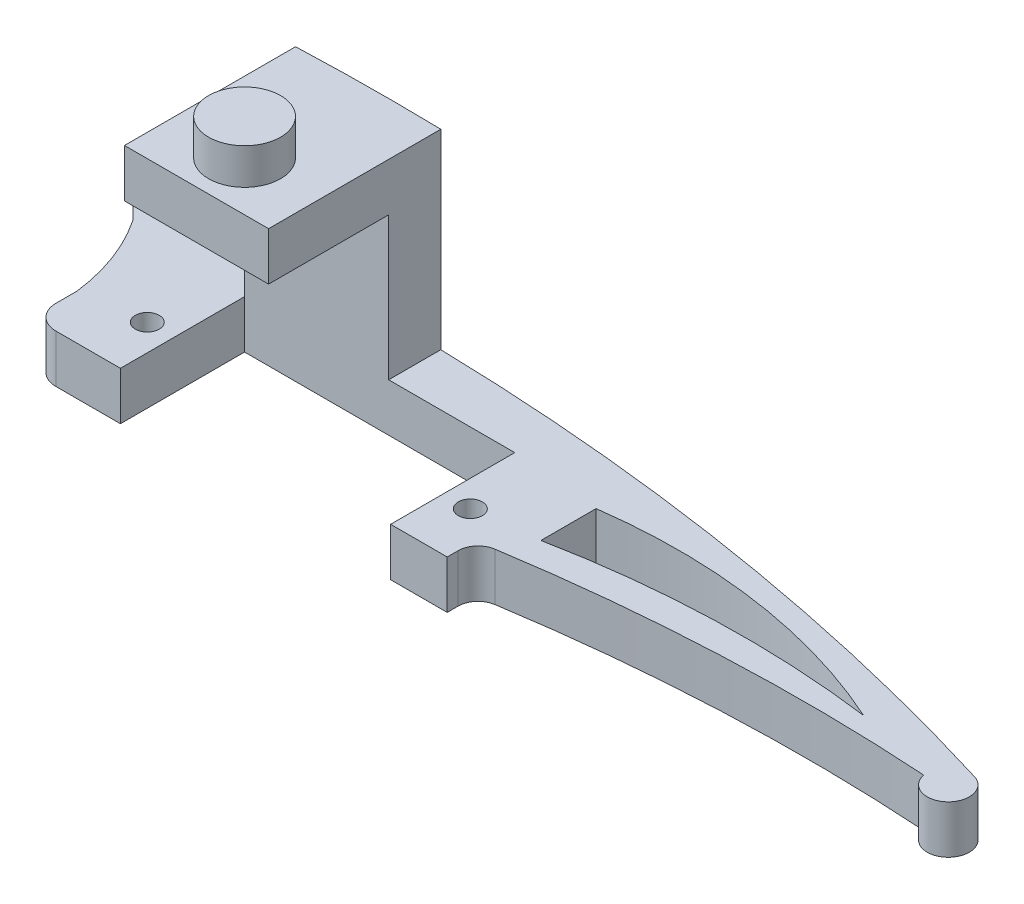
ISO-10303-21;
HEADER;
FILE_DESCRIPTION(('STEP AP214'),'2;1');
FILE_NAME('part.step','',(''),(''),'','','');
FILE_SCHEMA(('AUTOMOTIVE_DESIGN { 1 0 10303 214 1 1 1 1 }'));
ENDSEC;
DATA;
#1=APPLICATION_CONTEXT('core data for automotive mechanical design processes');
#2=APPLICATION_PROTOCOL_DEFINITION('international standard','automotive_design',2000,#1);
#3=PRODUCT_CONTEXT('',#1,'mechanical');
#4=PRODUCT('Part','Part','',(#3));
#5=PRODUCT_RELATED_PRODUCT_CATEGORY('part','',(#4));
#6=PRODUCT_DEFINITION_FORMATION('','',#4);
#7=PRODUCT_DEFINITION_CONTEXT('part definition',#1,'design');
#8=PRODUCT_DEFINITION('design','',#6,#7);
#9=PRODUCT_DEFINITION_SHAPE('','',#8);
#10=(LENGTH_UNIT() NAMED_UNIT(*) SI_UNIT(.MILLI.,.METRE.));
#11=(NAMED_UNIT(*) PLANE_ANGLE_UNIT() SI_UNIT($,.RADIAN.));
#12=(NAMED_UNIT(*) SI_UNIT($,.STERADIAN.) SOLID_ANGLE_UNIT());
#13=UNCERTAINTY_MEASURE_WITH_UNIT(LENGTH_MEASURE(1.E-05),#10,'distance_accuracy_value','');
#14=(GEOMETRIC_REPRESENTATION_CONTEXT(3) GLOBAL_UNCERTAINTY_ASSIGNED_CONTEXT((#13)) GLOBAL_UNIT_ASSIGNED_CONTEXT((#10,
#11,#12)) REPRESENTATION_CONTEXT('',''));
#15=CARTESIAN_POINT('',(0.,0.,0.));
#16=DIRECTION('',(0.,0.,1.));
#17=DIRECTION('',(1.,0.,0.));
#18=AXIS2_PLACEMENT_3D('',#15,#16,#17);
#19=CARTESIAN_POINT('',(14.,2.,-5.9));
#20=DIRECTION('',(0.,0.,-1.));
#21=DIRECTION('',(-1.,0.,0.));
#22=AXIS2_PLACEMENT_3D('',#19,#20,#21);
#23=PLANE('',#22);
#24=DIRECTION('',(1.,0.,0.));
#25=VECTOR('',#24,1.);
#26=CARTESIAN_POINT('',(14.,13.9,-5.9));
#27=LINE('',#26,#25);
#28=CARTESIAN_POINT('',(14.,13.9,-5.9));
#29=VERTEX_POINT('',#28);
#30=CARTESIAN_POINT('',(26.,13.9,-5.9));
#31=VERTEX_POINT('',#30);
#32=EDGE_CURVE('E221',#29,#31,#27,.T.);
#33=ORIENTED_EDGE('',*,*,#32,.F.);
#34=DIRECTION('',(0.,-1.,0.));
#35=VECTOR('',#34,1.);
#36=CARTESIAN_POINT('',(14.,17.9,-5.9));
#37=LINE('',#36,#35);
#38=CARTESIAN_POINT('',(14.,2.,-5.9));
#39=VERTEX_POINT('',#38);
#40=EDGE_CURVE('E225',#29,#39,#37,.T.);
#41=ORIENTED_EDGE('',*,*,#40,.T.);
#42=DIRECTION('',(0.,-1.,0.));
#43=VECTOR('',#42,1.);
#44=CARTESIAN_POINT('',(14.,2.,-5.9));
#45=LINE('',#44,#43);
#46=CARTESIAN_POINT('',(14.,-2.,-5.9));
#47=VERTEX_POINT('',#46);
#48=EDGE_CURVE('E38',#39,#47,#45,.T.);
#49=ORIENTED_EDGE('',*,*,#48,.T.);
#50=DIRECTION('',(1.,0.,0.));
#51=VECTOR('',#50,1.);
#52=CARTESIAN_POINT('',(14.,-2.,-5.9));
#53=LINE('',#52,#51);
#54=CARTESIAN_POINT('',(36.5,-2.,-5.9));
#55=VERTEX_POINT('',#54);
#56=EDGE_CURVE('E320',#47,#55,#53,.T.);
#57=ORIENTED_EDGE('',*,*,#56,.T.);
#58=DIRECTION('',(0.,-1.,0.));
#59=VECTOR('',#58,1.);
#60=CARTESIAN_POINT('',(36.5,2.,-5.9));
#61=LINE('',#60,#59);
#62=CARTESIAN_POINT('',(36.5,2.,-5.9));
#63=VERTEX_POINT('',#62);
#64=EDGE_CURVE('E391',#63,#55,#61,.T.);
#65=ORIENTED_EDGE('',*,*,#64,.F.);
#66=DIRECTION('',(1.,0.,0.));
#67=VECTOR('',#66,1.);
#68=CARTESIAN_POINT('',(14.,2.,-5.9));
#69=LINE('',#68,#67);
#70=CARTESIAN_POINT('',(26.,2.,-5.9));
#71=VERTEX_POINT('',#70);
#72=EDGE_CURVE('E286',#71,#63,#69,.T.);
#73=ORIENTED_EDGE('',*,*,#72,.F.);
#74=DIRECTION('',(0.,-1.,0.));
#75=VECTOR('',#74,1.);
#76=CARTESIAN_POINT('',(26.,17.9,-5.9));
#77=LINE('',#76,#75);
#78=EDGE_CURVE('E58',#31,#71,#77,.T.);
#79=ORIENTED_EDGE('',*,*,#78,.F.);
#80=EDGE_LOOP('',(#33,#41,#49,#57,#65,#73,#79));
#81=FACE_BOUND('',#80,.T.);
#82=ADVANCED_FACE('F34',(#81),#23,.F.);
#83=CARTESIAN_POINT('',(8.62634024035574,2.,2.4385181586324));
#84=DIRECTION('',(0.,-1.,0.));
#85=DIRECTION('',(0.,0.,-1.));
#86=AXIS2_PLACEMENT_3D('',#83,#84,#85);
#87=PLANE('',#86);
#88=CARTESIAN_POINT('',(11.8,2.,0.));
#89=DIRECTION('',(0.,1.,0.));
#90=DIRECTION('',(0.,0.,1.));
#91=AXIS2_PLACEMENT_3D('',#88,#89,#90);
#92=CIRCLE('',#91,1.);
#93=CARTESIAN_POINT('',(11.8,2.,1.));
#94=VERTEX_POINT('',#93);
#95=EDGE_CURVE('E278',#94,#94,#92,.T.);
#96=ORIENTED_EDGE('',*,*,#95,.F.);
#97=EDGE_LOOP('',(#96));
#98=FACE_BOUND('',#97,.T.);
#99=DIRECTION('',(0.,0.,1.));
#100=VECTOR('',#99,1.);
#101=CARTESIAN_POINT('',(14.,2.,-5.9));
#102=LINE('',#101,#100);
#103=CARTESIAN_POINT('',(14.,2.,-10.1461044190017));
#104=VERTEX_POINT('',#103);
#105=EDGE_CURVE('E50',#104,#39,#102,.T.);
#106=ORIENTED_EDGE('',*,*,#105,.F.);
#107=CARTESIAN_POINT('',(21.5542197661014,2.,185.548621723486));
#108=DIRECTION('',(0.,1.,0.));
#109=DIRECTION('',(0.,0.,1.));
#110=AXIS2_PLACEMENT_3D('',#107,#108,#109);
#111=CIRCLE('',#110,195.840476092808);
#112=CARTESIAN_POINT('',(10.0716883526537,2.,-9.95494230693514));
#113=VERTEX_POINT('',#112);
#114=EDGE_CURVE('E301',#104,#113,#111,.T.);
#115=ORIENTED_EDGE('',*,*,#114,.T.);
#116=CARTESIAN_POINT('',(-6.28370304347102,2.,28.8142367742464));
#117=DIRECTION('',(0.,1.,0.));
#118=DIRECTION('',(0.,0.,1.));
#119=AXIS2_PLACEMENT_3D('',#116,#117,#118);
#120=CIRCLE('',#119,42.0778810582132);
#121=CARTESIAN_POINT('',(1.62029316355011,2.,-12.5146262431236));
#122=VERTEX_POINT('',#121);
#123=EDGE_CURVE('E304',#113,#122,#120,.T.);
#124=ORIENTED_EDGE('',*,*,#123,.T.);
#125=CARTESIAN_POINT('',(1.36406447187878,2.,-11.1748431483622));
#126=DIRECTION('',(0.,1.,0.));
#127=DIRECTION('',(0.,0.,1.));
#128=AXIS2_PLACEMENT_3D('',#125,#126,#127);
#129=CIRCLE('',#128,1.36406447187879);
#130=CARTESIAN_POINT('',(0.399525233837648,2.,-10.2103039103211));
#131=VERTEX_POINT('',#130);
#132=EDGE_CURVE('E306',#122,#131,#129,.T.);
#133=ORIENTED_EDGE('',*,*,#132,.T.);
#134=DIRECTION('',(0.707106781186548,0.,0.707106781186547));
#135=VECTOR('',#134,1.);
#136=CARTESIAN_POINT('',(0.399525233837649,2.,-10.2103039103211));
#137=LINE('',#136,#135);
#138=CARTESIAN_POINT('',(3.82191689743255,2.,-6.78791224672617));
#139=VERTEX_POINT('',#138);
#140=EDGE_CURVE('E308',#131,#139,#137,.T.);
#141=ORIENTED_EDGE('',*,*,#140,.T.);
#142=CARTESIAN_POINT('',(-10.1704841528173,2.,2.72257085172816));
#143=DIRECTION('',(0.,-1.,0.));
#144=DIRECTION('',(0.,0.,-1.));
#145=AXIS2_PLACEMENT_3D('',#142,#143,#144);
#146=CIRCLE('',#145,16.9185275930566);
#147=CARTESIAN_POINT('',(6.62634024035574,2.,0.696918803145781));
#148=VERTEX_POINT('',#147);
#149=EDGE_CURVE('E310',#139,#148,#146,.T.);
#150=ORIENTED_EDGE('',*,*,#149,.T.);
#151=DIRECTION('',(0.,0.,1.));
#152=VECTOR('',#151,1.);
#153=CARTESIAN_POINT('',(6.62634024035574,2.,2.43851815863239));
#154=LINE('',#153,#152);
#155=CARTESIAN_POINT('',(6.62634024035574,2.,2.43851815863239));
#156=VERTEX_POINT('',#155);
#157=EDGE_CURVE('E312',#148,#156,#154,.T.);
#158=ORIENTED_EDGE('',*,*,#157,.T.);
#159=CARTESIAN_POINT('',(8.62634024035574,2.,2.4385181586324));
#160=DIRECTION('',(0.,1.,0.));
#161=DIRECTION('',(0.,0.,-1.));
#162=AXIS2_PLACEMENT_3D('',#159,#160,#161);
#163=CIRCLE('',#162,2.);
#164=CARTESIAN_POINT('',(8.62634024035575,2.,4.4385181586324));
#165=VERTEX_POINT('',#164);
#166=EDGE_CURVE('E314',#156,#165,#163,.T.);
#167=ORIENTED_EDGE('',*,*,#166,.T.);
#168=DIRECTION('',(1.,0.,0.));
#169=VECTOR('',#168,1.);
#170=CARTESIAN_POINT('',(14.,2.,4.4385181586324));
#171=LINE('',#170,#169);
#172=CARTESIAN_POINT('',(14.,2.,4.4385181586324));
#173=VERTEX_POINT('',#172);
#174=EDGE_CURVE('E316',#165,#173,#171,.T.);
#175=ORIENTED_EDGE('',*,*,#174,.T.);
#176=DIRECTION('',(0.,0.,-1.));
#177=VECTOR('',#176,1.);
#178=CARTESIAN_POINT('',(14.,2.,0.));
#179=LINE('',#178,#177);
#180=EDGE_CURVE('E284',#173,#39,#179,.T.);
#181=ORIENTED_EDGE('',*,*,#180,.T.);
#182=EDGE_LOOP('',(#106,#115,#124,#133,#141,#150,#158,#167,#175,#181));
#183=FACE_BOUND('',#182,.T.);
#184=ADVANCED_FACE('F433',(#98,#183),#87,.F.);
#185=CARTESIAN_POINT('',(50.3927536626238,2.,41.8430559351532));
#186=DIRECTION('',(0.,1.,0.));
#187=DIRECTION('',(0.,0.,1.));
#188=AXIS2_PLACEMENT_3D('',#185,#186,#187);
#189=CIRCLE('',#188,47.53522273895);
#190=CARTESIAN_POINT('',(69.981420933368,2.,-1.46839192101599));
#191=VERTEX_POINT('',#190);
#192=CARTESIAN_POINT('',(43.9242543366505,2.,-5.25));
#193=VERTEX_POINT('',#192);
#194=EDGE_CURVE('E248',#191,#193,#189,.T.);
#195=ORIENTED_EDGE('',*,*,#194,.F.);
#196=CARTESIAN_POINT('',(59.4329039404455,2.,77.9048055553327));
#197=DIRECTION('',(0.,-1.,0.));
#198=DIRECTION('',(0.,0.,-1.));
#199=AXIS2_PLACEMENT_3D('',#196,#197,#198);
#200=CIRCLE('',#199,80.071066487024);
#201=CARTESIAN_POINT('',(43.9242543366505,2.,-0.649999999999998));
#202=VERTEX_POINT('',#201);
#203=EDGE_CURVE('E254',#202,#191,#200,.T.);
#204=ORIENTED_EDGE('',*,*,#203,.F.);
#205=DIRECTION('',(0.,0.,1.));
#206=VECTOR('',#205,1.);
#207=CARTESIAN_POINT('',(43.9242543366505,2.,-5.25));
#208=LINE('',#207,#206);
#209=EDGE_CURVE('E250',#193,#202,#208,.T.);
#210=ORIENTED_EDGE('',*,*,#209,.F.);
#211=EDGE_LOOP('',(#195,#204,#210));
#212=FACE_BOUND('',#211,.T.);
#213=CARTESIAN_POINT('',(38.7,2.,0.));
#214=DIRECTION('',(0.,1.,0.));
#215=DIRECTION('',(0.,0.,1.));
#216=AXIS2_PLACEMENT_3D('',#213,#214,#215);
#217=CIRCLE('',#216,0.999999999999998);
#218=CARTESIAN_POINT('',(38.7,2.,0.999999999999998));
#219=VERTEX_POINT('',#218);
#220=EDGE_CURVE('E272',#219,#219,#217,.T.);
#221=ORIENTED_EDGE('',*,*,#220,.F.);
#222=EDGE_LOOP('',(#221));
#223=FACE_BOUND('',#222,.T.);
#224=DIRECTION('',(0.,0.,-1.));
#225=VECTOR('',#224,1.);
#226=CARTESIAN_POINT('',(26.,2.,-5.9));
#227=LINE('',#226,#225);
#228=CARTESIAN_POINT('',(26.,2.,-10.2413859744797));
#229=VERTEX_POINT('',#228);
#230=EDGE_CURVE('E226',#71,#229,#227,.T.);
#231=ORIENTED_EDGE('',*,*,#230,.F.);
#232=ORIENTED_EDGE('',*,*,#72,.T.);
#233=DIRECTION('',(0.,0.,1.));
#234=VECTOR('',#233,1.);
#235=CARTESIAN_POINT('',(36.5,2.,-5.9));
#236=LINE('',#235,#234);
#237=CARTESIAN_POINT('',(36.5,2.,4.4385181586324));
#238=VERTEX_POINT('',#237);
#239=EDGE_CURVE('E289',#63,#238,#236,.T.);
#240=ORIENTED_EDGE('',*,*,#239,.T.);
#241=DIRECTION('',(1.,0.,0.));
#242=VECTOR('',#241,1.);
#243=CARTESIAN_POINT('',(36.5,2.,4.4385181586324));
#244=LINE('',#243,#242);
#245=CARTESIAN_POINT('',(41.2135196632889,2.,4.4385181586324));
#246=VERTEX_POINT('',#245);
#247=EDGE_CURVE('E291',#238,#246,#244,.T.);
#248=ORIENTED_EDGE('',*,*,#247,.T.);
#249=DIRECTION('',(0.,0.,-1.));
#250=VECTOR('',#249,1.);
#251=CARTESIAN_POINT('',(41.2135196632889,2.,4.4385181586324));
#252=LINE('',#251,#250);
#253=CARTESIAN_POINT('',(41.2135196632889,2.,3.53621429674051));
#254=VERTEX_POINT('',#253);
#255=EDGE_CURVE('E293',#246,#254,#252,.T.);
#256=ORIENTED_EDGE('',*,*,#255,.T.);
#257=CARTESIAN_POINT('',(42.8824091488573,2.,3.53621429674051));
#258=DIRECTION('',(0.,-1.,0.));
#259=DIRECTION('',(0.,0.,-1.));
#260=AXIS2_PLACEMENT_3D('',#257,#258,#259);
#261=CIRCLE('',#260,1.66888948556837);
#262=CARTESIAN_POINT('',(42.621822840626,2.,1.88779478369079));
#263=VERTEX_POINT('',#262);
#264=EDGE_CURVE('E295',#254,#263,#261,.T.);
#265=ORIENTED_EDGE('',*,*,#264,.T.);
#266=CARTESIAN_POINT('',(66.6949978674598,2.,154.170129663986));
#267=DIRECTION('',(0.,-1.,0.));
#268=DIRECTION('',(0.,0.,-1.));
#269=AXIS2_PLACEMENT_3D('',#266,#267,#268);
#270=CIRCLE('',#269,154.173367584895);
#271=CARTESIAN_POINT('',(76.7808257933976,2.,0.32701689154066));
#272=VERTEX_POINT('',#271);
#273=EDGE_CURVE('E297',#263,#272,#270,.T.);
#274=ORIENTED_EDGE('',*,*,#273,.T.);
#275=CARTESIAN_POINT('',(78.5,2.,0.));
#276=DIRECTION('',(0.,1.,0.));
#277=DIRECTION('',(0.,0.,1.));
#278=AXIS2_PLACEMENT_3D('',#275,#276,#277);
#279=CIRCLE('',#278,1.75);
#280=CARTESIAN_POINT('',(79.0134467049361,2.,-1.67298310845934));
#281=VERTEX_POINT('',#280);
#282=EDGE_CURVE('E299',#272,#281,#279,.T.);
#283=ORIENTED_EDGE('',*,*,#282,.T.);
#284=EDGE_CURVE('E302',#281,#229,#111,.T.);
#285=ORIENTED_EDGE('',*,*,#284,.T.);
#286=EDGE_LOOP('',(#231,#232,#240,#248,#256,#265,#274,#283,#285));
#287=FACE_BOUND('',#286,.T.);
#288=ADVANCED_FACE('F416',(#212,#223,#287),#87,.F.);
#289=CARTESIAN_POINT('',(8.62634024035574,-2.,2.4385181586324));
#290=DIRECTION('',(0.,-1.,0.));
#291=DIRECTION('',(0.,0.,-1.));
#292=AXIS2_PLACEMENT_3D('',#289,#290,#291);
#293=PLANE('',#292);
#294=CARTESIAN_POINT('',(11.8,-2.,0.));
#295=DIRECTION('',(0.,1.,0.));
#296=DIRECTION('',(0.,0.,1.));
#297=AXIS2_PLACEMENT_3D('',#294,#295,#296);
#298=CIRCLE('',#297,1.);
#299=CARTESIAN_POINT('',(11.8,-2.,1.));
#300=VERTEX_POINT('',#299);
#301=EDGE_CURVE('E275',#300,#300,#298,.T.);
#302=ORIENTED_EDGE('',*,*,#301,.T.);
#303=EDGE_LOOP('',(#302));
#304=FACE_BOUND('',#303,.T.);
#305=DIRECTION('',(0.,0.,-1.));
#306=VECTOR('',#305,1.);
#307=CARTESIAN_POINT('',(14.,-2.,0.));
#308=LINE('',#307,#306);
#309=CARTESIAN_POINT('',(14.,-2.,4.4385181586324));
#310=VERTEX_POINT('',#309);
#311=EDGE_CURVE('E281',#310,#47,#308,.T.);
#312=ORIENTED_EDGE('',*,*,#311,.F.);
#313=DIRECTION('',(1.,0.,0.));
#314=VECTOR('',#313,1.);
#315=CARTESIAN_POINT('',(14.,-2.,4.4385181586324));
#316=LINE('',#315,#314);
#317=CARTESIAN_POINT('',(8.62634024035575,-2.,4.4385181586324));
#318=VERTEX_POINT('',#317);
#319=EDGE_CURVE('E287',#318,#310,#316,.T.);
#320=ORIENTED_EDGE('',*,*,#319,.F.);
#321=CARTESIAN_POINT('',(8.62634024035574,-2.,2.4385181586324));
#322=DIRECTION('',(0.,1.,0.));
#323=DIRECTION('',(0.,0.,-1.));
#324=AXIS2_PLACEMENT_3D('',#321,#322,#323);
#325=CIRCLE('',#324,2.);
#326=CARTESIAN_POINT('',(6.62634024035574,-2.,2.43851815863239));
#327=VERTEX_POINT('',#326);
#328=EDGE_CURVE('E347',#327,#318,#325,.T.);
#329=ORIENTED_EDGE('',*,*,#328,.F.);
#330=DIRECTION('',(0.,0.,1.));
#331=VECTOR('',#330,1.);
#332=CARTESIAN_POINT('',(6.62634024035574,-2.,2.43851815863239));
#333=LINE('',#332,#331);
#334=CARTESIAN_POINT('',(6.62634024035574,-2.,0.696918803145781));
#335=VERTEX_POINT('',#334);
#336=EDGE_CURVE('E345',#335,#327,#333,.T.);
#337=ORIENTED_EDGE('',*,*,#336,.F.);
#338=CARTESIAN_POINT('',(-10.1704841528173,-2.,2.72257085172816));
#339=DIRECTION('',(0.,-1.,0.));
#340=DIRECTION('',(0.,0.,-1.));
#341=AXIS2_PLACEMENT_3D('',#338,#339,#340);
#342=CIRCLE('',#341,16.9185275930566);
#343=CARTESIAN_POINT('',(3.82191689743255,-2.,-6.78791224672617));
#344=VERTEX_POINT('',#343);
#345=EDGE_CURVE('E343',#344,#335,#342,.T.);
#346=ORIENTED_EDGE('',*,*,#345,.F.);
#347=DIRECTION('',(0.707106781186548,0.,0.707106781186547));
#348=VECTOR('',#347,1.);
#349=CARTESIAN_POINT('',(0.399525233837649,-2.,-10.2103039103211));
#350=LINE('',#349,#348);
#351=CARTESIAN_POINT('',(0.399525233837648,-2.,-10.2103039103211));
#352=VERTEX_POINT('',#351);
#353=EDGE_CURVE('E341',#352,#344,#350,.T.);
#354=ORIENTED_EDGE('',*,*,#353,.F.);
#355=CARTESIAN_POINT('',(1.36406447187878,-2.,-11.1748431483622));
#356=DIRECTION('',(0.,1.,0.));
#357=DIRECTION('',(0.,0.,1.));
#358=AXIS2_PLACEMENT_3D('',#355,#356,#357);
#359=CIRCLE('',#358,1.36406447187879);
#360=CARTESIAN_POINT('',(1.62029316355011,-2.,-12.5146262431236));
#361=VERTEX_POINT('',#360);
#362=EDGE_CURVE('E339',#361,#352,#359,.T.);
#363=ORIENTED_EDGE('',*,*,#362,.F.);
#364=CARTESIAN_POINT('',(-6.28370304347102,-2.,28.8142367742464));
#365=DIRECTION('',(0.,1.,0.));
#366=DIRECTION('',(0.,0.,1.));
#367=AXIS2_PLACEMENT_3D('',#364,#365,#366);
#368=CIRCLE('',#367,42.0778810582132);
#369=CARTESIAN_POINT('',(10.0716883526537,-2.,-9.95494230693514));
#370=VERTEX_POINT('',#369);
#371=EDGE_CURVE('E337',#370,#361,#368,.T.);
#372=ORIENTED_EDGE('',*,*,#371,.F.);
#373=CARTESIAN_POINT('',(21.5542197661014,-2.,185.548621723486));
#374=DIRECTION('',(0.,1.,0.));
#375=DIRECTION('',(0.,0.,1.));
#376=AXIS2_PLACEMENT_3D('',#373,#374,#375);
#377=CIRCLE('',#376,195.840476092808);
#378=CARTESIAN_POINT('',(79.0134467049361,-2.,-1.67298310845934));
#379=VERTEX_POINT('',#378);
#380=EDGE_CURVE('E335',#379,#370,#377,.T.);
#381=ORIENTED_EDGE('',*,*,#380,.F.);
#382=CARTESIAN_POINT('',(78.5,-2.,0.));
#383=DIRECTION('',(0.,1.,0.));
#384=DIRECTION('',(0.,0.,1.));
#385=AXIS2_PLACEMENT_3D('',#382,#383,#384);
#386=CIRCLE('',#385,1.75);
#387=CARTESIAN_POINT('',(76.7808257933976,-2.,0.32701689154066));
#388=VERTEX_POINT('',#387);
#389=EDGE_CURVE('E333',#388,#379,#386,.T.);
#390=ORIENTED_EDGE('',*,*,#389,.F.);
#391=CARTESIAN_POINT('',(66.6949978674598,-2.,154.170129663986));
#392=DIRECTION('',(0.,-1.,0.));
#393=DIRECTION('',(0.,0.,-1.));
#394=AXIS2_PLACEMENT_3D('',#391,#392,#393);
#395=CIRCLE('',#394,154.173367584895);
#396=CARTESIAN_POINT('',(42.621822840626,-2.,1.88779478369079));
#397=VERTEX_POINT('',#396);
#398=EDGE_CURVE('E331',#397,#388,#395,.T.);
#399=ORIENTED_EDGE('',*,*,#398,.F.);
#400=CARTESIAN_POINT('',(42.8824091488573,-2.,3.53621429674051));
#401=DIRECTION('',(0.,-1.,0.));
#402=DIRECTION('',(0.,0.,-1.));
#403=AXIS2_PLACEMENT_3D('',#400,#401,#402);
#404=CIRCLE('',#403,1.66888948556837);
#405=CARTESIAN_POINT('',(41.2135196632889,-2.,3.53621429674051));
#406=VERTEX_POINT('',#405);
#407=EDGE_CURVE('E329',#406,#397,#404,.T.);
#408=ORIENTED_EDGE('',*,*,#407,.F.);
#409=DIRECTION('',(0.,0.,-1.));
#410=VECTOR('',#409,1.);
#411=CARTESIAN_POINT('',(41.2135196632889,-2.,4.4385181586324));
#412=LINE('',#411,#410);
#413=CARTESIAN_POINT('',(41.2135196632889,-2.,4.4385181586324));
#414=VERTEX_POINT('',#413);
#415=EDGE_CURVE('E327',#414,#406,#412,.T.);
#416=ORIENTED_EDGE('',*,*,#415,.F.);
#417=DIRECTION('',(1.,0.,0.));
#418=VECTOR('',#417,1.);
#419=CARTESIAN_POINT('',(36.5,-2.,4.4385181586324));
#420=LINE('',#419,#418);
#421=CARTESIAN_POINT('',(36.5,-2.,4.4385181586324));
#422=VERTEX_POINT('',#421);
#423=EDGE_CURVE('E325',#422,#414,#420,.T.);
#424=ORIENTED_EDGE('',*,*,#423,.F.);
#425=DIRECTION('',(0.,0.,1.));
#426=VECTOR('',#425,1.);
#427=CARTESIAN_POINT('',(36.5,-2.,0.));
#428=LINE('',#427,#426);
#429=EDGE_CURVE('E323',#55,#422,#428,.T.);
#430=ORIENTED_EDGE('',*,*,#429,.F.);
#431=ORIENTED_EDGE('',*,*,#56,.F.);
#432=EDGE_LOOP('',(#312,#320,#329,#337,#346,#354,#363,#372,#381,#390,#399,#408,#416,#424,#430,#431));
#433=FACE_BOUND('',#432,.T.);
#434=CARTESIAN_POINT('',(38.7,-2.,0.));
#435=DIRECTION('',(0.,1.,0.));
#436=DIRECTION('',(0.,0.,1.));
#437=AXIS2_PLACEMENT_3D('',#434,#435,#436);
#438=CIRCLE('',#437,0.999999999999998);
#439=CARTESIAN_POINT('',(38.7,-2.,0.999999999999998));
#440=VERTEX_POINT('',#439);
#441=EDGE_CURVE('E271',#440,#440,#438,.T.);
#442=ORIENTED_EDGE('',*,*,#441,.T.);
#443=EDGE_LOOP('',(#442));
#444=FACE_BOUND('',#443,.T.);
#445=CARTESIAN_POINT('',(59.4329039404455,-2.,77.9048055553327));
#446=DIRECTION('',(0.,-1.,0.));
#447=DIRECTION('',(0.,0.,-1.));
#448=AXIS2_PLACEMENT_3D('',#445,#446,#447);
#449=CIRCLE('',#448,80.071066487024);
#450=CARTESIAN_POINT('',(43.9242543366505,-2.,-0.65));
#451=VERTEX_POINT('',#450);
#452=CARTESIAN_POINT('',(69.981420933368,-2.,-1.46839192101599));
#453=VERTEX_POINT('',#452);
#454=EDGE_CURVE('E251',#451,#453,#449,.T.);
#455=ORIENTED_EDGE('',*,*,#454,.T.);
#456=CARTESIAN_POINT('',(50.3927536626238,-2.,41.8430559351532));
#457=DIRECTION('',(0.,1.,0.));
#458=DIRECTION('',(0.,0.,1.));
#459=AXIS2_PLACEMENT_3D('',#456,#457,#458);
#460=CIRCLE('',#459,47.53522273895);
#461=CARTESIAN_POINT('',(43.9242543366505,-2.,-5.25));
#462=VERTEX_POINT('',#461);
#463=EDGE_CURVE('E247',#453,#462,#460,.T.);
#464=ORIENTED_EDGE('',*,*,#463,.T.);
#465=DIRECTION('',(0.,0.,1.));
#466=VECTOR('',#465,1.);
#467=CARTESIAN_POINT('',(43.9242543366505,-2.,-5.25));
#468=LINE('',#467,#466);
#469=EDGE_CURVE('E259',#462,#451,#468,.T.);
#470=ORIENTED_EDGE('',*,*,#469,.T.);
#471=EDGE_LOOP('',(#455,#464,#470));
#472=FACE_BOUND('',#471,.T.);
#473=ADVANCED_FACE('F403',(#304,#433,#444,#472),#293,.T.);
#474=CARTESIAN_POINT('',(14.,2.,0.));
#475=DIRECTION('',(-1.,0.,0.));
#476=DIRECTION('',(0.,0.,1.));
#477=AXIS2_PLACEMENT_3D('',#474,#475,#476);
#478=PLANE('',#477);
#479=ORIENTED_EDGE('',*,*,#311,.T.);
#480=ORIENTED_EDGE('',*,*,#48,.F.);
#481=ORIENTED_EDGE('',*,*,#180,.F.);
#482=DIRECTION('',(0.,-1.,0.));
#483=VECTOR('',#482,1.);
#484=CARTESIAN_POINT('',(14.,2.,4.4385181586324));
#485=LINE('',#484,#483);
#486=EDGE_CURVE('E318',#173,#310,#485,.T.);
#487=ORIENTED_EDGE('',*,*,#486,.T.);
#488=EDGE_LOOP('',(#479,#480,#481,#487));
#489=FACE_BOUND('',#488,.T.);
#490=ADVANCED_FACE('F36',(#489),#478,.F.);
#491=CARTESIAN_POINT('',(36.5,2.,0.));
#492=DIRECTION('',(1.,0.,0.));
#493=DIRECTION('',(0.,0.,-1.));
#494=AXIS2_PLACEMENT_3D('',#491,#492,#493);
#495=PLANE('',#494);
#496=ORIENTED_EDGE('',*,*,#429,.T.);
#497=DIRECTION('',(0.,-1.,0.));
#498=VECTOR('',#497,1.);
#499=CARTESIAN_POINT('',(36.5,2.,4.4385181586324));
#500=LINE('',#499,#498);
#501=EDGE_CURVE('E389',#238,#422,#500,.T.);
#502=ORIENTED_EDGE('',*,*,#501,.F.);
#503=ORIENTED_EDGE('',*,*,#239,.F.);
#504=ORIENTED_EDGE('',*,*,#64,.T.);
#505=EDGE_LOOP('',(#496,#502,#503,#504));
#506=FACE_BOUND('',#505,.T.);
#507=ADVANCED_FACE('F409',(#506),#495,.F.);
#508=CARTESIAN_POINT('',(36.5,2.,4.4385181586324));
#509=DIRECTION('',(0.,0.,-1.));
#510=DIRECTION('',(-1.,0.,0.));
#511=AXIS2_PLACEMENT_3D('',#508,#509,#510);
#512=PLANE('',#511);
#513=ORIENTED_EDGE('',*,*,#423,.T.);
#514=DIRECTION('',(0.,-1.,0.));
#515=VECTOR('',#514,1.);
#516=CARTESIAN_POINT('',(41.2135196632889,2.,4.4385181586324));
#517=LINE('',#516,#515);
#518=EDGE_CURVE('E386',#246,#414,#517,.T.);
#519=ORIENTED_EDGE('',*,*,#518,.F.);
#520=ORIENTED_EDGE('',*,*,#247,.F.);
#521=ORIENTED_EDGE('',*,*,#501,.T.);
#522=EDGE_LOOP('',(#513,#519,#520,#521));
#523=FACE_BOUND('',#522,.T.);
#524=ADVANCED_FACE('F412',(#523),#512,.F.);
#525=CARTESIAN_POINT('',(41.2135196632889,2.,4.4385181586324));
#526=DIRECTION('',(-1.,0.,0.));
#527=DIRECTION('',(0.,0.,1.));
#528=AXIS2_PLACEMENT_3D('',#525,#526,#527);
#529=PLANE('',#528);
#530=ORIENTED_EDGE('',*,*,#415,.T.);
#531=DIRECTION('',(0.,-1.,0.));
#532=VECTOR('',#531,1.);
#533=CARTESIAN_POINT('',(41.2135196632889,2.,3.53621429674051));
#534=LINE('',#533,#532);
#535=EDGE_CURVE('E383',#254,#406,#534,.T.);
#536=ORIENTED_EDGE('',*,*,#535,.F.);
#537=ORIENTED_EDGE('',*,*,#255,.F.);
#538=ORIENTED_EDGE('',*,*,#518,.T.);
#539=EDGE_LOOP('',(#530,#536,#537,#538));
#540=FACE_BOUND('',#539,.T.);
#541=ADVANCED_FACE('F484',(#540),#529,.F.);
#542=CARTESIAN_POINT('',(42.8824091488573,2.,3.53621429674051));
#543=DIRECTION('',(0.,-1.,0.));
#544=DIRECTION('',(0.,0.,-1.));
#545=AXIS2_PLACEMENT_3D('',#542,#543,#544);
#546=CYLINDRICAL_SURFACE('',#545,1.66888948556837);
#547=ORIENTED_EDGE('',*,*,#407,.T.);
#548=DIRECTION('',(0.,-1.,0.));
#549=VECTOR('',#548,1.);
#550=CARTESIAN_POINT('',(42.621822840626,2.,1.88779478369079));
#551=LINE('',#550,#549);
#552=EDGE_CURVE('E380',#263,#397,#551,.T.);
#553=ORIENTED_EDGE('',*,*,#552,.F.);
#554=ORIENTED_EDGE('',*,*,#264,.F.);
#555=ORIENTED_EDGE('',*,*,#535,.T.);
#556=EDGE_LOOP('',(#547,#553,#554,#555));
#557=FACE_BOUND('',#556,.T.);
#558=ADVANCED_FACE('F487',(#557),#546,.F.);
#559=CARTESIAN_POINT('',(66.6949978674598,2.,154.170129663986));
#560=DIRECTION('',(0.,-1.,0.));
#561=DIRECTION('',(0.,0.,-1.));
#562=AXIS2_PLACEMENT_3D('',#559,#560,#561);
#563=CYLINDRICAL_SURFACE('',#562,154.173367584895);
#564=ORIENTED_EDGE('',*,*,#398,.T.);
#565=DIRECTION('',(0.,-1.,0.));
#566=VECTOR('',#565,1.);
#567=CARTESIAN_POINT('',(76.7808257933976,2.,0.32701689154066));
#568=LINE('',#567,#566);
#569=EDGE_CURVE('E377',#272,#388,#568,.T.);
#570=ORIENTED_EDGE('',*,*,#569,.F.);
#571=ORIENTED_EDGE('',*,*,#273,.F.);
#572=ORIENTED_EDGE('',*,*,#552,.T.);
#573=EDGE_LOOP('',(#564,#570,#571,#572));
#574=FACE_BOUND('',#573,.T.);
#575=ADVANCED_FACE('F491',(#574),#563,.F.);
#576=CARTESIAN_POINT('',(78.5,2.,0.));
#577=DIRECTION('',(0.,-1.,0.));
#578=DIRECTION('',(0.,0.,-1.));
#579=AXIS2_PLACEMENT_3D('',#576,#577,#578);
#580=CYLINDRICAL_SURFACE('',#579,1.75);
#581=ORIENTED_EDGE('',*,*,#389,.T.);
#582=DIRECTION('',(0.,-1.,0.));
#583=VECTOR('',#582,1.);
#584=CARTESIAN_POINT('',(79.0134467049361,2.,-1.67298310845934));
#585=LINE('',#584,#583);
#586=EDGE_CURVE('E374',#281,#379,#585,.T.);
#587=ORIENTED_EDGE('',*,*,#586,.F.);
#588=ORIENTED_EDGE('',*,*,#282,.F.);
#589=ORIENTED_EDGE('',*,*,#569,.T.);
#590=EDGE_LOOP('',(#581,#587,#588,#589));
#591=FACE_BOUND('',#590,.T.);
#592=ADVANCED_FACE('F495',(#591),#580,.T.);
#593=CARTESIAN_POINT('',(21.5542197661014,2.,185.548621723486));
#594=DIRECTION('',(0.,-1.,0.));
#595=DIRECTION('',(0.,0.,-1.));
#596=AXIS2_PLACEMENT_3D('',#593,#594,#595);
#597=CYLINDRICAL_SURFACE('',#596,195.840476092808);
#598=ORIENTED_EDGE('',*,*,#380,.T.);
#599=DIRECTION('',(0.,-1.,0.));
#600=VECTOR('',#599,1.);
#601=CARTESIAN_POINT('',(10.0716883526537,2.,-9.95494230693514));
#602=LINE('',#601,#600);
#603=EDGE_CURVE('E371',#113,#370,#602,.T.);
#604=ORIENTED_EDGE('',*,*,#603,.F.);
#605=ORIENTED_EDGE('',*,*,#114,.F.);
#606=DIRECTION('',(0.,-1.,0.));
#607=VECTOR('',#606,1.);
#608=CARTESIAN_POINT('',(14.,17.9,-10.1461044190011));
#609=LINE('',#608,#607);
#610=CARTESIAN_POINT('',(14.,17.9,-10.1461044190011));
#611=VERTEX_POINT('',#610);
#612=EDGE_CURVE('E240',#611,#104,#609,.T.);
#613=ORIENTED_EDGE('',*,*,#612,.F.);
#614=CARTESIAN_POINT('',(21.5542197661014,17.9,185.548621723486));
#615=DIRECTION('',(0.,1.,0.));
#616=DIRECTION('',(0.,0.,1.));
#617=AXIS2_PLACEMENT_3D('',#614,#615,#616);
#618=CIRCLE('',#617,195.840476092808);
#619=CARTESIAN_POINT('',(26.,17.9,-10.2413859744797));
#620=VERTEX_POINT('',#619);
#621=EDGE_CURVE('E234',#620,#611,#618,.T.);
#622=ORIENTED_EDGE('',*,*,#621,.F.);
#623=DIRECTION('',(0.,-1.,0.));
#624=VECTOR('',#623,1.);
#625=CARTESIAN_POINT('',(26.,17.9,-10.2413859744797));
#626=LINE('',#625,#624);
#627=EDGE_CURVE('E243',#620,#229,#626,.T.);
#628=ORIENTED_EDGE('',*,*,#627,.T.);
#629=ORIENTED_EDGE('',*,*,#284,.F.);
#630=ORIENTED_EDGE('',*,*,#586,.T.);
#631=EDGE_LOOP('',(#598,#604,#605,#613,#622,#628,#629,#630));
#632=FACE_BOUND('',#631,.T.);
#633=ADVANCED_FACE('F430',(#632),#597,.T.);
#634=CARTESIAN_POINT('',(-6.28370304347102,2.,28.8142367742464));
#635=DIRECTION('',(0.,-1.,0.));
#636=DIRECTION('',(0.,0.,-1.));
#637=AXIS2_PLACEMENT_3D('',#634,#635,#636);
#638=CYLINDRICAL_SURFACE('',#637,42.0778810582132);
#639=ORIENTED_EDGE('',*,*,#371,.T.);
#640=DIRECTION('',(0.,-1.,0.));
#641=VECTOR('',#640,1.);
#642=CARTESIAN_POINT('',(1.62029316355011,2.,-12.5146262431236));
#643=LINE('',#642,#641);
#644=EDGE_CURVE('E368',#122,#361,#643,.T.);
#645=ORIENTED_EDGE('',*,*,#644,.F.);
#646=ORIENTED_EDGE('',*,*,#123,.F.);
#647=ORIENTED_EDGE('',*,*,#603,.T.);
#648=EDGE_LOOP('',(#639,#645,#646,#647));
#649=FACE_BOUND('',#648,.T.);
#650=ADVANCED_FACE('F438',(#649),#638,.T.);
#651=CARTESIAN_POINT('',(1.36406447187878,2.,-11.1748431483622));
#652=DIRECTION('',(0.,-1.,0.));
#653=DIRECTION('',(0.,0.,-1.));
#654=AXIS2_PLACEMENT_3D('',#651,#652,#653);
#655=CYLINDRICAL_SURFACE('',#654,1.36406447187879);
#656=ORIENTED_EDGE('',*,*,#362,.T.);
#657=DIRECTION('',(0.,-1.,0.));
#658=VECTOR('',#657,1.);
#659=CARTESIAN_POINT('',(0.399525233837648,2.,-10.2103039103211));
#660=LINE('',#659,#658);
#661=EDGE_CURVE('E365',#131,#352,#660,.T.);
#662=ORIENTED_EDGE('',*,*,#661,.F.);
#663=ORIENTED_EDGE('',*,*,#132,.F.);
#664=ORIENTED_EDGE('',*,*,#644,.T.);
#665=EDGE_LOOP('',(#656,#662,#663,#664));
#666=FACE_BOUND('',#665,.T.);
#667=ADVANCED_FACE('F442',(#666),#655,.T.);
#668=CARTESIAN_POINT('',(0.399525233837649,2.,-10.2103039103211));
#669=DIRECTION('',(0.707106781186547,0.,-0.707106781186548));
#670=DIRECTION('',(-0.707106781186548,0.,-0.707106781186547));
#671=AXIS2_PLACEMENT_3D('',#668,#669,#670);
#672=PLANE('',#671);
#673=ORIENTED_EDGE('',*,*,#353,.T.);
#674=DIRECTION('',(0.,-1.,0.));
#675=VECTOR('',#674,1.);
#676=CARTESIAN_POINT('',(3.82191689743255,2.,-6.78791224672617));
#677=LINE('',#676,#675);
#678=EDGE_CURVE('E362',#139,#344,#677,.T.);
#679=ORIENTED_EDGE('',*,*,#678,.F.);
#680=ORIENTED_EDGE('',*,*,#140,.F.);
#681=ORIENTED_EDGE('',*,*,#661,.T.);
#682=EDGE_LOOP('',(#673,#679,#680,#681));
#683=FACE_BOUND('',#682,.T.);
#684=ADVANCED_FACE('F447',(#683),#672,.F.);
#685=CARTESIAN_POINT('',(-10.1704841528173,2.,2.72257085172816));
#686=DIRECTION('',(0.,-1.,0.));
#687=DIRECTION('',(0.,0.,-1.));
#688=AXIS2_PLACEMENT_3D('',#685,#686,#687);
#689=CYLINDRICAL_SURFACE('',#688,16.9185275930566);
#690=ORIENTED_EDGE('',*,*,#345,.T.);
#691=DIRECTION('',(0.,-1.,0.));
#692=VECTOR('',#691,1.);
#693=CARTESIAN_POINT('',(6.62634024035574,2.,0.696918803145781));
#694=LINE('',#693,#692);
#695=EDGE_CURVE('E359',#148,#335,#694,.T.);
#696=ORIENTED_EDGE('',*,*,#695,.F.);
#697=ORIENTED_EDGE('',*,*,#149,.F.);
#698=ORIENTED_EDGE('',*,*,#678,.T.);
#699=EDGE_LOOP('',(#690,#696,#697,#698));
#700=FACE_BOUND('',#699,.T.);
#701=ADVANCED_FACE('F453',(#700),#689,.F.);
#702=CARTESIAN_POINT('',(6.62634024035574,2.,2.43851815863239));
#703=DIRECTION('',(1.,0.,0.));
#704=DIRECTION('',(0.,0.,-1.));
#705=AXIS2_PLACEMENT_3D('',#702,#703,#704);
#706=PLANE('',#705);
#707=ORIENTED_EDGE('',*,*,#336,.T.);
#708=DIRECTION('',(0.,-1.,0.));
#709=VECTOR('',#708,1.);
#710=CARTESIAN_POINT('',(6.62634024035574,2.,2.43851815863239));
#711=LINE('',#710,#709);
#712=EDGE_CURVE('E356',#156,#327,#711,.T.);
#713=ORIENTED_EDGE('',*,*,#712,.F.);
#714=ORIENTED_EDGE('',*,*,#157,.F.);
#715=ORIENTED_EDGE('',*,*,#695,.T.);
#716=EDGE_LOOP('',(#707,#713,#714,#715));
#717=FACE_BOUND('',#716,.T.);
#718=ADVANCED_FACE('F457',(#717),#706,.F.);
#719=CARTESIAN_POINT('',(8.62634024035574,2.,2.4385181586324));
#720=DIRECTION('',(0.,-1.,0.));
#721=DIRECTION('',(0.,0.,-1.));
#722=AXIS2_PLACEMENT_3D('',#719,#720,#721);
#723=CYLINDRICAL_SURFACE('',#722,2.);
#724=ORIENTED_EDGE('',*,*,#328,.T.);
#725=DIRECTION('',(0.,-1.,0.));
#726=VECTOR('',#725,1.);
#727=CARTESIAN_POINT('',(8.62634024035575,2.,4.4385181586324));
#728=LINE('',#727,#726);
#729=EDGE_CURVE('E353',#165,#318,#728,.T.);
#730=ORIENTED_EDGE('',*,*,#729,.F.);
#731=ORIENTED_EDGE('',*,*,#166,.F.);
#732=ORIENTED_EDGE('',*,*,#712,.T.);
#733=EDGE_LOOP('',(#724,#730,#731,#732));
#734=FACE_BOUND('',#733,.T.);
#735=ADVANCED_FACE('F462',(#734),#723,.T.);
#736=CARTESIAN_POINT('',(14.,2.,4.4385181586324));
#737=DIRECTION('',(0.,0.,-1.));
#738=DIRECTION('',(-1.,0.,0.));
#739=AXIS2_PLACEMENT_3D('',#736,#737,#738);
#740=PLANE('',#739);
#741=ORIENTED_EDGE('',*,*,#319,.T.);
#742=ORIENTED_EDGE('',*,*,#486,.F.);
#743=ORIENTED_EDGE('',*,*,#174,.F.);
#744=ORIENTED_EDGE('',*,*,#729,.T.);
#745=EDGE_LOOP('',(#741,#742,#743,#744));
#746=FACE_BOUND('',#745,.T.);
#747=ADVANCED_FACE('F466',(#746),#740,.F.);
#748=CARTESIAN_POINT('',(11.8,2.,0.));
#749=DIRECTION('',(0.,-1.,0.));
#750=DIRECTION('',(0.,0.,-1.));
#751=AXIS2_PLACEMENT_3D('',#748,#749,#750);
#752=CYLINDRICAL_SURFACE('',#751,1.);
#753=ORIENTED_EDGE('',*,*,#95,.T.);
#754=EDGE_LOOP('',(#753));
#755=FACE_BOUND('',#754,.T.);
#756=ORIENTED_EDGE('',*,*,#301,.F.);
#757=EDGE_LOOP('',(#756));
#758=FACE_BOUND('',#757,.T.);
#759=ADVANCED_FACE('F515',(#755,#758),#752,.F.);
#760=CARTESIAN_POINT('',(38.7,2.,0.));
#761=DIRECTION('',(0.,-1.,0.));
#762=DIRECTION('',(0.,0.,-1.));
#763=AXIS2_PLACEMENT_3D('',#760,#761,#762);
#764=CYLINDRICAL_SURFACE('',#763,0.999999999999998);
#765=ORIENTED_EDGE('',*,*,#220,.T.);
#766=EDGE_LOOP('',(#765));
#767=FACE_BOUND('',#766,.T.);
#768=ORIENTED_EDGE('',*,*,#441,.F.);
#769=EDGE_LOOP('',(#768));
#770=FACE_BOUND('',#769,.T.);
#771=ADVANCED_FACE('F519',(#767,#770),#764,.F.);
#772=CARTESIAN_POINT('',(50.3927536626238,2.,41.8430559351532));
#773=DIRECTION('',(0.,-1.,0.));
#774=DIRECTION('',(0.,0.,-1.));
#775=AXIS2_PLACEMENT_3D('',#772,#773,#774);
#776=CYLINDRICAL_SURFACE('',#775,47.53522273895);
#777=ORIENTED_EDGE('',*,*,#463,.F.);
#778=DIRECTION('',(0.,-1.,0.));
#779=VECTOR('',#778,1.);
#780=CARTESIAN_POINT('',(69.981420933368,2.,-1.46839192101599));
#781=LINE('',#780,#779);
#782=EDGE_CURVE('E256',#191,#453,#781,.T.);
#783=ORIENTED_EDGE('',*,*,#782,.F.);
#784=ORIENTED_EDGE('',*,*,#194,.T.);
#785=DIRECTION('',(0.,-1.,0.));
#786=VECTOR('',#785,1.);
#787=CARTESIAN_POINT('',(43.9242543366505,2.,-5.25));
#788=LINE('',#787,#786);
#789=EDGE_CURVE('E268',#193,#462,#788,.T.);
#790=ORIENTED_EDGE('',*,*,#789,.T.);
#791=EDGE_LOOP('',(#777,#783,#784,#790));
#792=FACE_BOUND('',#791,.T.);
#793=ADVANCED_FACE('F523',(#792),#776,.F.);
#794=CARTESIAN_POINT('',(43.9242543366505,2.,-5.25));
#795=DIRECTION('',(1.,0.,0.));
#796=DIRECTION('',(0.,0.,-1.));
#797=AXIS2_PLACEMENT_3D('',#794,#795,#796);
#798=PLANE('',#797);
#799=ORIENTED_EDGE('',*,*,#469,.F.);
#800=ORIENTED_EDGE('',*,*,#789,.F.);
#801=ORIENTED_EDGE('',*,*,#209,.T.);
#802=DIRECTION('',(0.,-1.,0.));
#803=VECTOR('',#802,1.);
#804=CARTESIAN_POINT('',(43.9242543366505,2.,-0.65));
#805=LINE('',#804,#803);
#806=EDGE_CURVE('E266',#202,#451,#805,.T.);
#807=ORIENTED_EDGE('',*,*,#806,.T.);
#808=EDGE_LOOP('',(#799,#800,#801,#807));
#809=FACE_BOUND('',#808,.T.);
#810=ADVANCED_FACE('F527',(#809),#798,.T.);
#811=CARTESIAN_POINT('',(59.4329039404455,2.,77.9048055553327));
#812=DIRECTION('',(0.,-1.,0.));
#813=DIRECTION('',(0.,0.,-1.));
#814=AXIS2_PLACEMENT_3D('',#811,#812,#813);
#815=CYLINDRICAL_SURFACE('',#814,80.071066487024);
#816=ORIENTED_EDGE('',*,*,#454,.F.);
#817=ORIENTED_EDGE('',*,*,#806,.F.);
#818=ORIENTED_EDGE('',*,*,#203,.T.);
#819=ORIENTED_EDGE('',*,*,#782,.T.);
#820=EDGE_LOOP('',(#816,#817,#818,#819));
#821=FACE_BOUND('',#820,.T.);
#822=ADVANCED_FACE('F531',(#821),#815,.T.);
#823=CARTESIAN_POINT('',(26.,17.9,-5.9));
#824=DIRECTION('',(-1.,0.,0.));
#825=DIRECTION('',(0.,0.,1.));
#826=AXIS2_PLACEMENT_3D('',#823,#824,#825);
#827=PLANE('',#826);
#828=ORIENTED_EDGE('',*,*,#230,.T.);
#829=ORIENTED_EDGE('',*,*,#627,.F.);
#830=DIRECTION('',(0.,0.,-1.));
#831=VECTOR('',#830,1.);
#832=CARTESIAN_POINT('',(26.,17.9,-5.9));
#833=LINE('',#832,#831);
#834=CARTESIAN_POINT('',(26.,17.9,4.1));
#835=VERTEX_POINT('',#834);
#836=EDGE_CURVE('E232',#835,#620,#833,.T.);
#837=ORIENTED_EDGE('',*,*,#836,.F.);
#838=DIRECTION('',(0.,1.,0.));
#839=VECTOR('',#838,1.);
#840=CARTESIAN_POINT('',(26.,13.9,4.1));
#841=LINE('',#840,#839);
#842=CARTESIAN_POINT('',(26.,13.9,4.1));
#843=VERTEX_POINT('',#842);
#844=EDGE_CURVE('E211',#843,#835,#841,.T.);
#845=ORIENTED_EDGE('',*,*,#844,.F.);
#846=DIRECTION('',(0.,0.,-1.));
#847=VECTOR('',#846,1.);
#848=CARTESIAN_POINT('',(26.,13.9,4.1));
#849=LINE('',#848,#847);
#850=EDGE_CURVE('E207',#843,#31,#849,.T.);
#851=ORIENTED_EDGE('',*,*,#850,.T.);
#852=ORIENTED_EDGE('',*,*,#78,.T.);
#853=EDGE_LOOP('',(#828,#829,#837,#845,#851,#852));
#854=FACE_BOUND('',#853,.T.);
#855=ADVANCED_FACE('F535',(#854),#827,.F.);
#856=CARTESIAN_POINT('',(14.,17.9,-5.9));
#857=DIRECTION('',(1.,0.,0.));
#858=DIRECTION('',(0.,0.,-1.));
#859=AXIS2_PLACEMENT_3D('',#856,#857,#858);
#860=PLANE('',#859);
#861=ORIENTED_EDGE('',*,*,#105,.T.);
#862=ORIENTED_EDGE('',*,*,#40,.F.);
#863=DIRECTION('',(0.,0.,-1.));
#864=VECTOR('',#863,1.);
#865=CARTESIAN_POINT('',(14.,13.9,4.1));
#866=LINE('',#865,#864);
#867=CARTESIAN_POINT('',(14.,13.9,4.1));
#868=VERTEX_POINT('',#867);
#869=EDGE_CURVE('E205',#868,#29,#866,.T.);
#870=ORIENTED_EDGE('',*,*,#869,.F.);
#871=DIRECTION('',(0.,-1.,0.));
#872=VECTOR('',#871,1.);
#873=CARTESIAN_POINT('',(14.,17.9,4.1));
#874=LINE('',#873,#872);
#875=CARTESIAN_POINT('',(14.,17.9,4.1));
#876=VERTEX_POINT('',#875);
#877=EDGE_CURVE('E212',#876,#868,#874,.T.);
#878=ORIENTED_EDGE('',*,*,#877,.F.);
#879=DIRECTION('',(0.,0.,1.));
#880=VECTOR('',#879,1.);
#881=CARTESIAN_POINT('',(14.,17.9,-5.9));
#882=LINE('',#881,#880);
#883=EDGE_CURVE('E236',#611,#876,#882,.T.);
#884=ORIENTED_EDGE('',*,*,#883,.F.);
#885=ORIENTED_EDGE('',*,*,#612,.T.);
#886=EDGE_LOOP('',(#861,#862,#870,#878,#884,#885));
#887=FACE_BOUND('',#886,.T.);
#888=ADVANCED_FACE('F224',(#887),#860,.F.);
#889=CARTESIAN_POINT('',(21.5542197661014,17.9,185.548621723486));
#890=DIRECTION('',(0.,1.,0.));
#891=DIRECTION('',(0.,0.,1.));
#892=AXIS2_PLACEMENT_3D('',#889,#890,#891);
#893=PLANE('',#892);
#894=CARTESIAN_POINT('',(19.9,17.9,0.));
#895=DIRECTION('',(0.,1.,0.));
#896=DIRECTION('',(0.,0.,1.));
#897=AXIS2_PLACEMENT_3D('',#894,#895,#896);
#898=CIRCLE('',#897,3.);
#899=CARTESIAN_POINT('',(19.9,17.9,3.));
#900=VERTEX_POINT('',#899);
#901=EDGE_CURVE('E11',#900,#900,#898,.T.);
#902=ORIENTED_EDGE('',*,*,#901,.F.);
#903=EDGE_LOOP('',(#902));
#904=FACE_BOUND('',#903,.T.);
#905=ORIENTED_EDGE('',*,*,#883,.T.);
#906=DIRECTION('',(-1.,0.,0.));
#907=VECTOR('',#906,1.);
#908=CARTESIAN_POINT('',(26.,17.9,4.1));
#909=LINE('',#908,#907);
#910=EDGE_CURVE('E218',#835,#876,#909,.T.);
#911=ORIENTED_EDGE('',*,*,#910,.F.);
#912=ORIENTED_EDGE('',*,*,#836,.T.);
#913=ORIENTED_EDGE('',*,*,#621,.T.);
#914=EDGE_LOOP('',(#905,#911,#912,#913));
#915=FACE_BOUND('',#914,.T.);
#916=ADVANCED_FACE('F425',(#904,#915),#893,.T.);
#917=CARTESIAN_POINT('',(14.,13.9,4.1));
#918=DIRECTION('',(0.,1.,0.));
#919=DIRECTION('',(0.,0.,1.));
#920=AXIS2_PLACEMENT_3D('',#917,#918,#919);
#921=PLANE('',#920);
#922=ORIENTED_EDGE('',*,*,#32,.T.);
#923=ORIENTED_EDGE('',*,*,#850,.F.);
#924=DIRECTION('',(1.,0.,0.));
#925=VECTOR('',#924,1.);
#926=CARTESIAN_POINT('',(14.,13.9,4.1));
#927=LINE('',#926,#925);
#928=EDGE_CURVE('E201',#868,#843,#927,.T.);
#929=ORIENTED_EDGE('',*,*,#928,.F.);
#930=ORIENTED_EDGE('',*,*,#869,.T.);
#931=EDGE_LOOP('',(#922,#923,#929,#930));
#932=FACE_BOUND('',#931,.T.);
#933=ADVANCED_FACE('F203',(#932),#921,.F.);
#934=CARTESIAN_POINT('',(0.,0.,4.1));
#935=DIRECTION('',(0.,0.,1.));
#936=DIRECTION('',(1.,0.,0.));
#937=AXIS2_PLACEMENT_3D('',#934,#935,#936);
#938=PLANE('',#937);
#939=ORIENTED_EDGE('',*,*,#877,.T.);
#940=ORIENTED_EDGE('',*,*,#928,.T.);
#941=ORIENTED_EDGE('',*,*,#844,.T.);
#942=ORIENTED_EDGE('',*,*,#910,.T.);
#943=EDGE_LOOP('',(#939,#940,#941,#942));
#944=FACE_BOUND('',#943,.T.);
#945=ADVANCED_FACE('F216',(#944),#938,.T.);
#946=CARTESIAN_POINT('',(19.9,20.9,0.));
#947=DIRECTION('',(0.,-1.,0.));
#948=DIRECTION('',(0.,0.,-1.));
#949=AXIS2_PLACEMENT_3D('',#946,#947,#948);
#950=CYLINDRICAL_SURFACE('',#949,3.);
#951=CARTESIAN_POINT('',(19.9,20.9,0.));
#952=DIRECTION('',(0.,1.,0.));
#953=DIRECTION('',(0.,0.,1.));
#954=AXIS2_PLACEMENT_3D('',#951,#952,#953);
#955=CIRCLE('',#954,3.);
#956=CARTESIAN_POINT('',(19.9,20.9,3.));
#957=VERTEX_POINT('',#956);
#958=EDGE_CURVE('E419',#957,#957,#955,.T.);
#959=ORIENTED_EDGE('',*,*,#958,.F.);
#960=EDGE_LOOP('',(#959));
#961=FACE_BOUND('',#960,.T.);
#962=ORIENTED_EDGE('',*,*,#901,.T.);
#963=EDGE_LOOP('',(#962));
#964=FACE_BOUND('',#963,.T.);
#965=ADVANCED_FACE('F548',(#961,#964),#950,.T.);
#966=CARTESIAN_POINT('',(19.9,20.9,0.));
#967=DIRECTION('',(0.,1.,0.));
#968=DIRECTION('',(0.,0.,1.));
#969=AXIS2_PLACEMENT_3D('',#966,#967,#968);
#970=PLANE('',#969);
#971=ORIENTED_EDGE('',*,*,#958,.T.);
#972=EDGE_LOOP('',(#971));
#973=FACE_BOUND('',#972,.T.);
#974=ADVANCED_FACE('F551',(#973),#970,.T.);
#975=CLOSED_SHELL('',(#82,#184,#288,#473,#490,#507,#524,#541,#558,#575,#592,#633,#650,#667,#684,
#701,#718,#735,#747,#759,#771,#793,#810,#822,#855,#888,#916,#933,#945,#965,#974));
#976=MANIFOLD_SOLID_BREP('B2',#975);
#977=ADVANCED_BREP_SHAPE_REPRESENTATION('',(#18,#976),#14);
#978=SHAPE_DEFINITION_REPRESENTATION(#9,#977);
ENDSEC;
END-ISO-10303-21;
